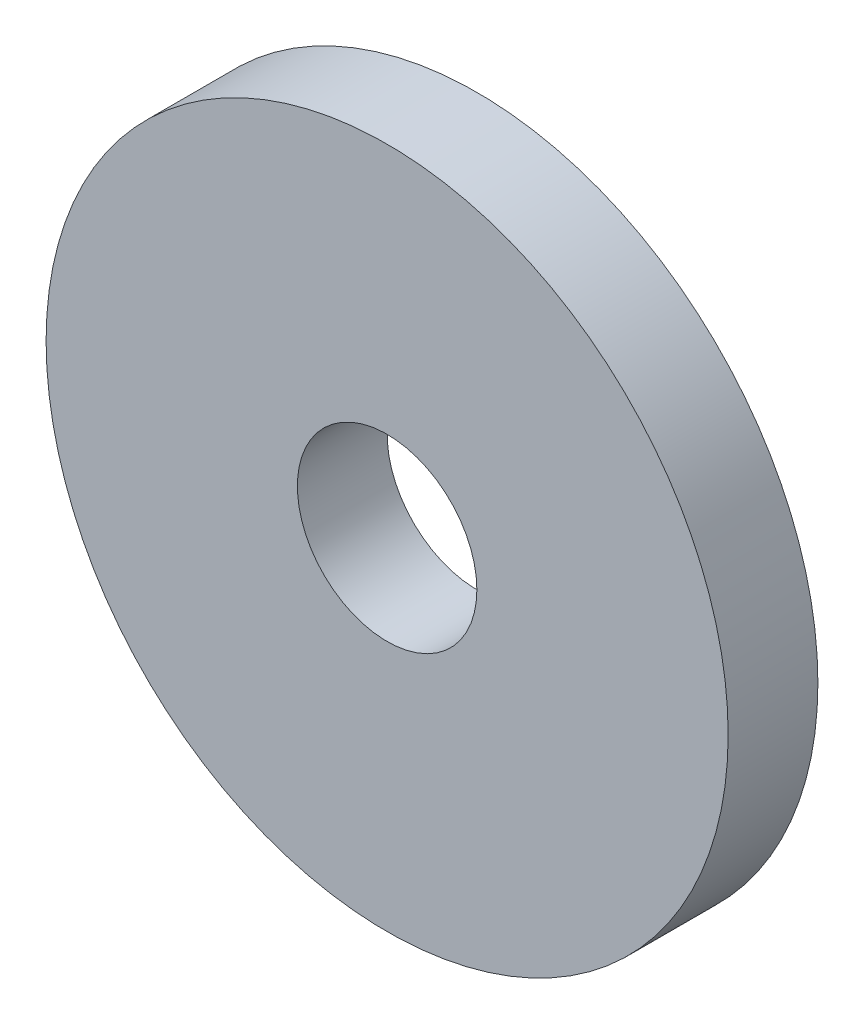
ISO-10303-21;
HEADER;
FILE_DESCRIPTION(('STEP AP214'),'2;1');
FILE_NAME('part.step','',(''),(''),'','','');
FILE_SCHEMA(('AUTOMOTIVE_DESIGN { 1 0 10303 214 1 1 1 1 }'));
ENDSEC;
DATA;
#1=APPLICATION_CONTEXT('core data for automotive mechanical design processes');
#2=APPLICATION_PROTOCOL_DEFINITION('international standard','automotive_design',2000,#1);
#3=PRODUCT_CONTEXT('',#1,'mechanical');
#4=PRODUCT('Part','Part','',(#3));
#5=PRODUCT_RELATED_PRODUCT_CATEGORY('part','',(#4));
#6=PRODUCT_DEFINITION_FORMATION('','',#4);
#7=PRODUCT_DEFINITION_CONTEXT('part definition',#1,'design');
#8=PRODUCT_DEFINITION('design','',#6,#7);
#9=PRODUCT_DEFINITION_SHAPE('','',#8);
#10=(LENGTH_UNIT() NAMED_UNIT(*) SI_UNIT(.MILLI.,.METRE.));
#11=(NAMED_UNIT(*) PLANE_ANGLE_UNIT() SI_UNIT($,.RADIAN.));
#12=(NAMED_UNIT(*) SI_UNIT($,.STERADIAN.) SOLID_ANGLE_UNIT());
#13=UNCERTAINTY_MEASURE_WITH_UNIT(LENGTH_MEASURE(1.E-05),#10,'distance_accuracy_value','');
#14=(GEOMETRIC_REPRESENTATION_CONTEXT(3) GLOBAL_UNCERTAINTY_ASSIGNED_CONTEXT((#13)) GLOBAL_UNIT_ASSIGNED_CONTEXT((#10,
#11,#12)) REPRESENTATION_CONTEXT('',''));
#15=CARTESIAN_POINT('',(0.,0.,0.));
#16=DIRECTION('',(0.,0.,1.));
#17=DIRECTION('',(1.,0.,0.));
#18=AXIS2_PLACEMENT_3D('',#15,#16,#17);
#19=CARTESIAN_POINT('',(0.,0.,2.5));
#20=DIRECTION('',(0.,0.,1.));
#21=DIRECTION('',(1.,0.,0.));
#22=AXIS2_PLACEMENT_3D('',#19,#20,#21);
#23=PLANE('',#22);
#24=CARTESIAN_POINT('',(0.,0.,2.5));
#25=DIRECTION('',(0.,0.,1.));
#26=DIRECTION('',(1.,0.,0.));
#27=AXIS2_PLACEMENT_3D('',#24,#25,#26);
#28=CIRCLE('',#27,9.5);
#29=CARTESIAN_POINT('',(9.5,0.,2.5));
#30=VERTEX_POINT('',#29);
#31=EDGE_CURVE('E10',#30,#30,#28,.T.);
#32=ORIENTED_EDGE('',*,*,#31,.T.);
#33=EDGE_LOOP('',(#32));
#34=FACE_BOUND('',#33,.T.);
#35=CARTESIAN_POINT('',(0.,0.,2.5));
#36=DIRECTION('',(0.,0.,1.));
#37=DIRECTION('',(1.,0.,0.));
#38=AXIS2_PLACEMENT_3D('',#35,#36,#37);
#39=CIRCLE('',#38,2.5);
#40=CARTESIAN_POINT('',(2.5,0.,2.5));
#41=VERTEX_POINT('',#40);
#42=EDGE_CURVE('E48',#41,#41,#39,.T.);
#43=ORIENTED_EDGE('',*,*,#42,.F.);
#44=EDGE_LOOP('',(#43));
#45=FACE_BOUND('',#44,.T.);
#46=ADVANCED_FACE('F37',(#34,#45),#23,.T.);
#47=CARTESIAN_POINT('',(0.,0.,0.));
#48=DIRECTION('',(0.,0.,1.));
#49=DIRECTION('',(1.,0.,0.));
#50=AXIS2_PLACEMENT_3D('',#47,#48,#49);
#51=PLANE('',#50);
#52=CARTESIAN_POINT('',(0.,0.,0.));
#53=DIRECTION('',(0.,0.,1.));
#54=DIRECTION('',(1.,0.,0.));
#55=AXIS2_PLACEMENT_3D('',#52,#53,#54);
#56=CIRCLE('',#55,9.5);
#57=CARTESIAN_POINT('',(9.5,0.,0.));
#58=VERTEX_POINT('',#57);
#59=EDGE_CURVE('E41',#58,#58,#56,.T.);
#60=ORIENTED_EDGE('',*,*,#59,.F.);
#61=EDGE_LOOP('',(#60));
#62=FACE_BOUND('',#61,.T.);
#63=CARTESIAN_POINT('',(0.,0.,0.));
#64=DIRECTION('',(0.,0.,1.));
#65=DIRECTION('',(1.,0.,0.));
#66=AXIS2_PLACEMENT_3D('',#63,#64,#65);
#67=CIRCLE('',#66,2.5);
#68=CARTESIAN_POINT('',(2.5,0.,0.));
#69=VERTEX_POINT('',#68);
#70=EDGE_CURVE('E50',#69,#69,#67,.T.);
#71=ORIENTED_EDGE('',*,*,#70,.T.);
#72=EDGE_LOOP('',(#71));
#73=FACE_BOUND('',#72,.T.);
#74=ADVANCED_FACE('F60',(#62,#73),#51,.F.);
#75=CARTESIAN_POINT('',(0.,0.,2.5));
#76=DIRECTION('',(0.,0.,-1.));
#77=DIRECTION('',(-1.,0.,0.));
#78=AXIS2_PLACEMENT_3D('',#75,#76,#77);
#79=CYLINDRICAL_SURFACE('',#78,9.5);
#80=ORIENTED_EDGE('',*,*,#31,.F.);
#81=EDGE_LOOP('',(#80));
#82=FACE_BOUND('',#81,.T.);
#83=ORIENTED_EDGE('',*,*,#59,.T.);
#84=EDGE_LOOP('',(#83));
#85=FACE_BOUND('',#84,.T.);
#86=ADVANCED_FACE('F39',(#82,#85),#79,.T.);
#87=CARTESIAN_POINT('',(0.,0.,2.5));
#88=DIRECTION('',(0.,0.,-1.));
#89=DIRECTION('',(-1.,0.,0.));
#90=AXIS2_PLACEMENT_3D('',#87,#88,#89);
#91=CYLINDRICAL_SURFACE('',#90,2.5);
#92=ORIENTED_EDGE('',*,*,#42,.T.);
#93=EDGE_LOOP('',(#92));
#94=FACE_BOUND('',#93,.T.);
#95=ORIENTED_EDGE('',*,*,#70,.F.);
#96=EDGE_LOOP('',(#95));
#97=FACE_BOUND('',#96,.T.);
#98=ADVANCED_FACE('F56',(#94,#97),#91,.F.);
#99=CLOSED_SHELL('',(#46,#74,#86,#98));
#100=MANIFOLD_SOLID_BREP('B2',#99);
#101=ADVANCED_BREP_SHAPE_REPRESENTATION('',(#18,#100),#14);
#102=SHAPE_DEFINITION_REPRESENTATION(#9,#101);
ENDSEC;
END-ISO-10303-21;
